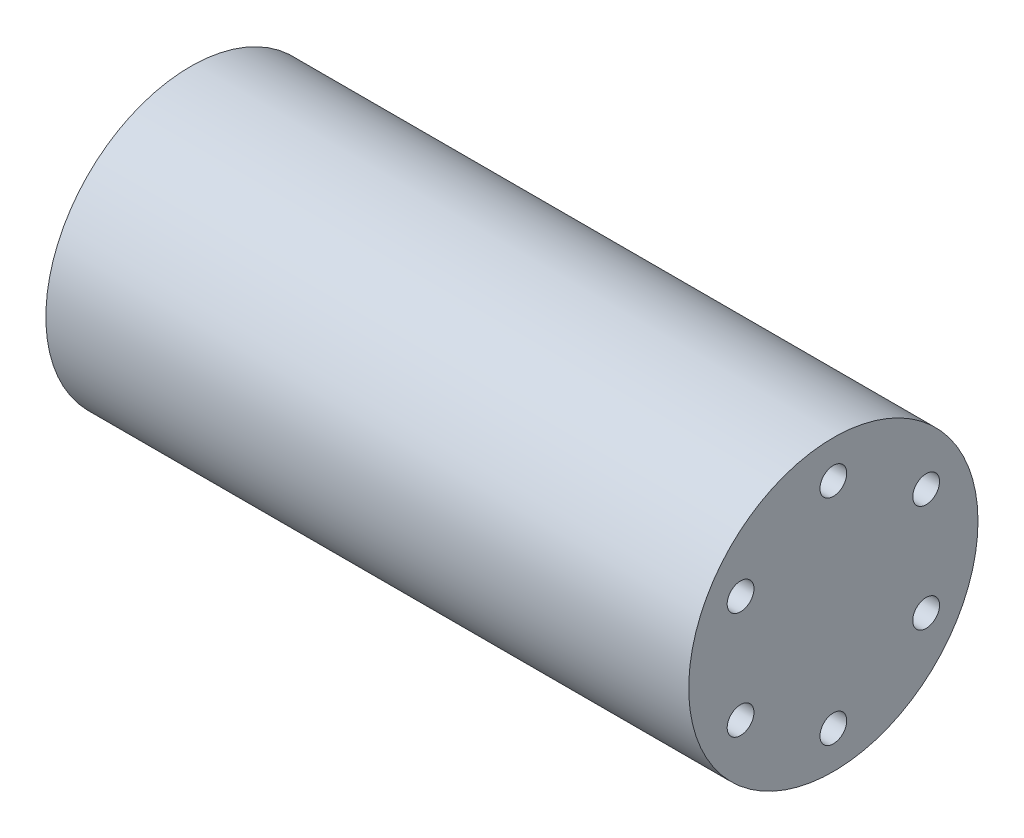
ISO-10303-21;
HEADER;
FILE_DESCRIPTION(('STEP AP214'),'2;1');
FILE_NAME('part.step','',(''),(''),'','','');
FILE_SCHEMA(('AUTOMOTIVE_DESIGN { 1 0 10303 214 1 1 1 1 }'));
ENDSEC;
DATA;
#1=APPLICATION_CONTEXT('core data for automotive mechanical design processes');
#2=APPLICATION_PROTOCOL_DEFINITION('international standard','automotive_design',2000,#1);
#3=PRODUCT_CONTEXT('',#1,'mechanical');
#4=PRODUCT('Part','Part','',(#3));
#5=PRODUCT_RELATED_PRODUCT_CATEGORY('part','',(#4));
#6=PRODUCT_DEFINITION_FORMATION('','',#4);
#7=PRODUCT_DEFINITION_CONTEXT('part definition',#1,'design');
#8=PRODUCT_DEFINITION('design','',#6,#7);
#9=PRODUCT_DEFINITION_SHAPE('','',#8);
#10=(LENGTH_UNIT() NAMED_UNIT(*) SI_UNIT(.MILLI.,.METRE.));
#11=(NAMED_UNIT(*) PLANE_ANGLE_UNIT() SI_UNIT($,.RADIAN.));
#12=(NAMED_UNIT(*) SI_UNIT($,.STERADIAN.) SOLID_ANGLE_UNIT());
#13=UNCERTAINTY_MEASURE_WITH_UNIT(LENGTH_MEASURE(1.E-05),#10,'distance_accuracy_value','');
#14=(GEOMETRIC_REPRESENTATION_CONTEXT(3) GLOBAL_UNCERTAINTY_ASSIGNED_CONTEXT((#13)) GLOBAL_UNIT_ASSIGNED_CONTEXT((#10,
#11,#12)) REPRESENTATION_CONTEXT('',''));
#15=CARTESIAN_POINT('',(0.,0.,0.));
#16=DIRECTION('',(0.,0.,1.));
#17=DIRECTION('',(1.,0.,0.));
#18=AXIS2_PLACEMENT_3D('',#15,#16,#17);
#19=CARTESIAN_POINT('',(30.,0.,0.));
#20=DIRECTION('',(-1.,0.,0.));
#21=DIRECTION('',(0.,0.,1.));
#22=AXIS2_PLACEMENT_3D('',#19,#20,#21);
#23=CYLINDRICAL_SURFACE('',#22,13.5);
#24=CARTESIAN_POINT('',(30.,0.,0.));
#25=DIRECTION('',(1.,0.,0.));
#26=DIRECTION('',(0.,0.,-1.));
#27=AXIS2_PLACEMENT_3D('',#24,#25,#26);
#28=CIRCLE('',#27,13.5);
#29=CARTESIAN_POINT('',(30.,0.,-13.5));
#30=VERTEX_POINT('',#29);
#31=EDGE_CURVE('E10',#30,#30,#28,.T.);
#32=ORIENTED_EDGE('',*,*,#31,.F.);
#33=EDGE_LOOP('',(#32));
#34=FACE_BOUND('',#33,.T.);
#35=CARTESIAN_POINT('',(-30.,0.,0.));
#36=DIRECTION('',(1.,0.,0.));
#37=DIRECTION('',(0.,0.,-1.));
#38=AXIS2_PLACEMENT_3D('',#35,#36,#37);
#39=CIRCLE('',#38,13.5);
#40=CARTESIAN_POINT('',(-30.,0.,-13.5));
#41=VERTEX_POINT('',#40);
#42=EDGE_CURVE('E46',#41,#41,#39,.T.);
#43=ORIENTED_EDGE('',*,*,#42,.T.);
#44=EDGE_LOOP('',(#43));
#45=FACE_BOUND('',#44,.T.);
#46=ADVANCED_FACE('F43',(#34,#45),#23,.T.);
#47=CARTESIAN_POINT('',(30.,0.,0.));
#48=DIRECTION('',(1.,0.,0.));
#49=DIRECTION('',(0.,0.,-1.));
#50=AXIS2_PLACEMENT_3D('',#47,#48,#49);
#51=PLANE('',#50);
#52=CARTESIAN_POINT('',(30.,10.,0.));
#53=DIRECTION('',(-1.,0.,0.));
#54=DIRECTION('',(0.,0.,1.));
#55=AXIS2_PLACEMENT_3D('',#52,#53,#54);
#56=CIRCLE('',#55,1.25);
#57=CARTESIAN_POINT('',(30.,10.,1.25));
#58=VERTEX_POINT('',#57);
#59=EDGE_CURVE('E138',#58,#58,#56,.T.);
#60=ORIENTED_EDGE('',*,*,#59,.T.);
#61=EDGE_LOOP('',(#60));
#62=FACE_BOUND('',#61,.T.);
#63=CARTESIAN_POINT('',(30.,5.0000000000001,-8.66025403784433));
#64=DIRECTION('',(-1.,0.,0.));
#65=DIRECTION('',(0.,0.,1.));
#66=AXIS2_PLACEMENT_3D('',#63,#64,#65);
#67=CIRCLE('',#66,1.25);
#68=CARTESIAN_POINT('',(30.,5.0000000000001,-7.41025403784433));
#69=VERTEX_POINT('',#68);
#70=EDGE_CURVE('E139',#69,#69,#67,.T.);
#71=ORIENTED_EDGE('',*,*,#70,.T.);
#72=EDGE_LOOP('',(#71));
#73=FACE_BOUND('',#72,.T.);
#74=CARTESIAN_POINT('',(30.,-4.99999999999992,-8.66025403784443));
#75=DIRECTION('',(-1.,0.,0.));
#76=DIRECTION('',(0.,0.,1.));
#77=AXIS2_PLACEMENT_3D('',#74,#75,#76);
#78=CIRCLE('',#77,1.25);
#79=CARTESIAN_POINT('',(30.,-4.99999999999992,-7.41025403784443));
#80=VERTEX_POINT('',#79);
#81=EDGE_CURVE('E105',#80,#80,#78,.T.);
#82=ORIENTED_EDGE('',*,*,#81,.T.);
#83=EDGE_LOOP('',(#82));
#84=FACE_BOUND('',#83,.T.);
#85=CARTESIAN_POINT('',(30.,-10.,0.));
#86=DIRECTION('',(-1.,0.,0.));
#87=DIRECTION('',(0.,0.,1.));
#88=AXIS2_PLACEMENT_3D('',#85,#86,#87);
#89=CIRCLE('',#88,1.25);
#90=CARTESIAN_POINT('',(30.,-10.,1.24999999999993));
#91=VERTEX_POINT('',#90);
#92=EDGE_CURVE('E114',#91,#91,#89,.T.);
#93=ORIENTED_EDGE('',*,*,#92,.T.);
#94=EDGE_LOOP('',(#93));
#95=FACE_BOUND('',#94,.T.);
#96=CARTESIAN_POINT('',(30.,-5.00000000000004,8.66025403784437));
#97=DIRECTION('',(-1.,0.,0.));
#98=DIRECTION('',(0.,0.,1.));
#99=AXIS2_PLACEMENT_3D('',#96,#97,#98);
#100=CIRCLE('',#99,1.25);
#101=CARTESIAN_POINT('',(30.,-5.00000000000004,9.91025403784437));
#102=VERTEX_POINT('',#101);
#103=EDGE_CURVE('E122',#102,#102,#100,.T.);
#104=ORIENTED_EDGE('',*,*,#103,.T.);
#105=EDGE_LOOP('',(#104));
#106=FACE_BOUND('',#105,.T.);
#107=CARTESIAN_POINT('',(30.,4.99999999999998,8.6602540378444));
#108=DIRECTION('',(-1.,0.,0.));
#109=DIRECTION('',(0.,0.,1.));
#110=AXIS2_PLACEMENT_3D('',#107,#108,#109);
#111=CIRCLE('',#110,1.25);
#112=CARTESIAN_POINT('',(30.,4.99999999999998,9.9102540378444));
#113=VERTEX_POINT('',#112);
#114=EDGE_CURVE('E130',#113,#113,#111,.T.);
#115=ORIENTED_EDGE('',*,*,#114,.T.);
#116=EDGE_LOOP('',(#115));
#117=FACE_BOUND('',#116,.T.);
#118=ORIENTED_EDGE('',*,*,#31,.T.);
#119=EDGE_LOOP('',(#118));
#120=FACE_BOUND('',#119,.T.);
#121=ADVANCED_FACE('F165',(#62,#73,#84,#95,#106,#117,#120),#51,.T.);
#122=CARTESIAN_POINT('',(-30.,0.,0.));
#123=DIRECTION('',(1.,0.,0.));
#124=DIRECTION('',(0.,0.,-1.));
#125=AXIS2_PLACEMENT_3D('',#122,#123,#124);
#126=PLANE('',#125);
#127=CARTESIAN_POINT('',(-30.,10.,0.));
#128=DIRECTION('',(-1.,0.,0.));
#129=DIRECTION('',(0.,0.,1.));
#130=AXIS2_PLACEMENT_3D('',#127,#128,#129);
#131=CIRCLE('',#130,1.25);
#132=CARTESIAN_POINT('',(-30.,10.,1.25));
#133=VERTEX_POINT('',#132);
#134=EDGE_CURVE('E90',#133,#133,#131,.T.);
#135=ORIENTED_EDGE('',*,*,#134,.F.);
#136=EDGE_LOOP('',(#135));
#137=FACE_BOUND('',#136,.T.);
#138=CARTESIAN_POINT('',(-30.,5.0000000000001,-8.66025403784433));
#139=DIRECTION('',(-1.,0.,0.));
#140=DIRECTION('',(0.,0.,1.));
#141=AXIS2_PLACEMENT_3D('',#138,#139,#140);
#142=CIRCLE('',#141,1.25);
#143=CARTESIAN_POINT('',(-30.,5.0000000000001,-7.41025403784433));
#144=VERTEX_POINT('',#143);
#145=EDGE_CURVE('E62',#144,#144,#142,.T.);
#146=ORIENTED_EDGE('',*,*,#145,.F.);
#147=EDGE_LOOP('',(#146));
#148=FACE_BOUND('',#147,.T.);
#149=CARTESIAN_POINT('',(-30.,-4.99999999999992,-8.66025403784443));
#150=DIRECTION('',(-1.,0.,0.));
#151=DIRECTION('',(0.,0.,1.));
#152=AXIS2_PLACEMENT_3D('',#149,#150,#151);
#153=CIRCLE('',#152,1.25);
#154=CARTESIAN_POINT('',(-30.,-4.99999999999992,-7.41025403784443));
#155=VERTEX_POINT('',#154);
#156=EDGE_CURVE('E61',#155,#155,#153,.T.);
#157=ORIENTED_EDGE('',*,*,#156,.F.);
#158=EDGE_LOOP('',(#157));
#159=FACE_BOUND('',#158,.T.);
#160=CARTESIAN_POINT('',(-30.,-10.,0.));
#161=DIRECTION('',(-1.,0.,0.));
#162=DIRECTION('',(0.,0.,1.));
#163=AXIS2_PLACEMENT_3D('',#160,#161,#162);
#164=CIRCLE('',#163,1.25);
#165=CARTESIAN_POINT('',(-30.,-10.,1.24999999999993));
#166=VERTEX_POINT('',#165);
#167=EDGE_CURVE('E70',#166,#166,#164,.T.);
#168=ORIENTED_EDGE('',*,*,#167,.F.);
#169=EDGE_LOOP('',(#168));
#170=FACE_BOUND('',#169,.T.);
#171=CARTESIAN_POINT('',(-30.,-5.00000000000004,8.66025403784437));
#172=DIRECTION('',(-1.,0.,0.));
#173=DIRECTION('',(0.,0.,1.));
#174=AXIS2_PLACEMENT_3D('',#171,#172,#173);
#175=CIRCLE('',#174,1.25);
#176=CARTESIAN_POINT('',(-30.,-5.00000000000004,9.91025403784437));
#177=VERTEX_POINT('',#176);
#178=EDGE_CURVE('E78',#177,#177,#175,.T.);
#179=ORIENTED_EDGE('',*,*,#178,.F.);
#180=EDGE_LOOP('',(#179));
#181=FACE_BOUND('',#180,.T.);
#182=CARTESIAN_POINT('',(-30.,4.99999999999998,8.6602540378444));
#183=DIRECTION('',(-1.,0.,0.));
#184=DIRECTION('',(0.,0.,1.));
#185=AXIS2_PLACEMENT_3D('',#182,#183,#184);
#186=CIRCLE('',#185,1.25);
#187=CARTESIAN_POINT('',(-30.,4.99999999999998,9.9102540378444));
#188=VERTEX_POINT('',#187);
#189=EDGE_CURVE('E86',#188,#188,#186,.T.);
#190=ORIENTED_EDGE('',*,*,#189,.F.);
#191=EDGE_LOOP('',(#190));
#192=FACE_BOUND('',#191,.T.);
#193=ORIENTED_EDGE('',*,*,#42,.F.);
#194=EDGE_LOOP('',(#193));
#195=FACE_BOUND('',#194,.T.);
#196=ADVANCED_FACE('F171',(#137,#148,#159,#170,#181,#192,#195),#126,.F.);
#197=CARTESIAN_POINT('',(-26.,4.99999999999998,8.6602540378444));
#198=DIRECTION('',(-1.,0.,0.));
#199=DIRECTION('',(0.,0.,1.));
#200=AXIS2_PLACEMENT_3D('',#197,#198,#199);
#201=CYLINDRICAL_SURFACE('',#200,1.25);
#202=CARTESIAN_POINT('',(-26.,4.99999999999998,8.6602540378444));
#203=DIRECTION('',(-1.,0.,0.));
#204=DIRECTION('',(0.,0.,1.));
#205=AXIS2_PLACEMENT_3D('',#202,#203,#204);
#206=CIRCLE('',#205,1.25);
#207=CARTESIAN_POINT('',(-26.,4.99999999999998,9.9102540378444));
#208=VERTEX_POINT('',#207);
#209=EDGE_CURVE('E82',#208,#208,#206,.T.);
#210=ORIENTED_EDGE('',*,*,#209,.F.);
#211=EDGE_LOOP('',(#210));
#212=FACE_BOUND('',#211,.T.);
#213=ORIENTED_EDGE('',*,*,#189,.T.);
#214=EDGE_LOOP('',(#213));
#215=FACE_BOUND('',#214,.T.);
#216=ADVANCED_FACE('F177',(#212,#215),#201,.F.);
#217=CARTESIAN_POINT('',(-26.,4.99999999999998,8.6602540378444));
#218=DIRECTION('',(-1.,0.,0.));
#219=DIRECTION('',(0.,0.,1.));
#220=AXIS2_PLACEMENT_3D('',#217,#218,#219);
#221=PLANE('',#220);
#222=ORIENTED_EDGE('',*,*,#209,.T.);
#223=EDGE_LOOP('',(#222));
#224=FACE_BOUND('',#223,.T.);
#225=ADVANCED_FACE('F182',(#224),#221,.T.);
#226=CARTESIAN_POINT('',(-26.,-5.00000000000004,8.66025403784437));
#227=DIRECTION('',(-1.,0.,0.));
#228=DIRECTION('',(0.,0.,1.));
#229=AXIS2_PLACEMENT_3D('',#226,#227,#228);
#230=CYLINDRICAL_SURFACE('',#229,1.25);
#231=CARTESIAN_POINT('',(-26.,-5.00000000000004,8.66025403784437));
#232=DIRECTION('',(-1.,0.,0.));
#233=DIRECTION('',(0.,0.,1.));
#234=AXIS2_PLACEMENT_3D('',#231,#232,#233);
#235=CIRCLE('',#234,1.25);
#236=CARTESIAN_POINT('',(-26.,-5.00000000000004,9.91025403784437));
#237=VERTEX_POINT('',#236);
#238=EDGE_CURVE('E74',#237,#237,#235,.T.);
#239=ORIENTED_EDGE('',*,*,#238,.F.);
#240=EDGE_LOOP('',(#239));
#241=FACE_BOUND('',#240,.T.);
#242=ORIENTED_EDGE('',*,*,#178,.T.);
#243=EDGE_LOOP('',(#242));
#244=FACE_BOUND('',#243,.T.);
#245=ADVANCED_FACE('F208',(#241,#244),#230,.F.);
#246=CARTESIAN_POINT('',(-26.,-5.00000000000004,8.66025403784437));
#247=DIRECTION('',(-1.,0.,0.));
#248=DIRECTION('',(0.,0.,1.));
#249=AXIS2_PLACEMENT_3D('',#246,#247,#248);
#250=PLANE('',#249);
#251=ORIENTED_EDGE('',*,*,#238,.T.);
#252=EDGE_LOOP('',(#251));
#253=FACE_BOUND('',#252,.T.);
#254=ADVANCED_FACE('F204',(#253),#250,.T.);
#255=CARTESIAN_POINT('',(-26.,-10.,0.));
#256=DIRECTION('',(-1.,0.,0.));
#257=DIRECTION('',(0.,0.,1.));
#258=AXIS2_PLACEMENT_3D('',#255,#256,#257);
#259=CYLINDRICAL_SURFACE('',#258,1.25);
#260=CARTESIAN_POINT('',(-26.,-10.,0.));
#261=DIRECTION('',(-1.,0.,0.));
#262=DIRECTION('',(0.,0.,1.));
#263=AXIS2_PLACEMENT_3D('',#260,#261,#262);
#264=CIRCLE('',#263,1.25);
#265=CARTESIAN_POINT('',(-26.,-10.,1.24999999999993));
#266=VERTEX_POINT('',#265);
#267=EDGE_CURVE('E66',#266,#266,#264,.T.);
#268=ORIENTED_EDGE('',*,*,#267,.F.);
#269=EDGE_LOOP('',(#268));
#270=FACE_BOUND('',#269,.T.);
#271=ORIENTED_EDGE('',*,*,#167,.T.);
#272=EDGE_LOOP('',(#271));
#273=FACE_BOUND('',#272,.T.);
#274=ADVANCED_FACE('F200',(#270,#273),#259,.F.);
#275=CARTESIAN_POINT('',(-26.,-10.,0.));
#276=DIRECTION('',(-1.,0.,0.));
#277=DIRECTION('',(0.,0.,1.));
#278=AXIS2_PLACEMENT_3D('',#275,#276,#277);
#279=PLANE('',#278);
#280=ORIENTED_EDGE('',*,*,#267,.T.);
#281=EDGE_LOOP('',(#280));
#282=FACE_BOUND('',#281,.T.);
#283=ADVANCED_FACE('F196',(#282),#279,.T.);
#284=CARTESIAN_POINT('',(-26.,-4.99999999999992,-8.66025403784443));
#285=DIRECTION('',(-1.,0.,0.));
#286=DIRECTION('',(0.,0.,1.));
#287=AXIS2_PLACEMENT_3D('',#284,#285,#286);
#288=CYLINDRICAL_SURFACE('',#287,1.25);
#289=CARTESIAN_POINT('',(-26.,-4.99999999999992,-8.66025403784443));
#290=DIRECTION('',(-1.,0.,0.));
#291=DIRECTION('',(0.,0.,1.));
#292=AXIS2_PLACEMENT_3D('',#289,#290,#291);
#293=CIRCLE('',#292,1.25);
#294=CARTESIAN_POINT('',(-26.,-4.99999999999992,-7.41025403784443));
#295=VERTEX_POINT('',#294);
#296=EDGE_CURVE('E57',#295,#295,#293,.T.);
#297=ORIENTED_EDGE('',*,*,#296,.F.);
#298=EDGE_LOOP('',(#297));
#299=FACE_BOUND('',#298,.T.);
#300=ORIENTED_EDGE('',*,*,#156,.T.);
#301=EDGE_LOOP('',(#300));
#302=FACE_BOUND('',#301,.T.);
#303=ADVANCED_FACE('F192',(#299,#302),#288,.F.);
#304=CARTESIAN_POINT('',(-26.,-4.99999999999992,-8.66025403784443));
#305=DIRECTION('',(-1.,0.,0.));
#306=DIRECTION('',(0.,0.,1.));
#307=AXIS2_PLACEMENT_3D('',#304,#305,#306);
#308=PLANE('',#307);
#309=ORIENTED_EDGE('',*,*,#296,.T.);
#310=EDGE_LOOP('',(#309));
#311=FACE_BOUND('',#310,.T.);
#312=ADVANCED_FACE('F188',(#311),#308,.T.);
#313=CARTESIAN_POINT('',(-26.,5.0000000000001,-8.66025403784433));
#314=DIRECTION('',(-1.,0.,0.));
#315=DIRECTION('',(0.,0.,1.));
#316=AXIS2_PLACEMENT_3D('',#313,#314,#315);
#317=CYLINDRICAL_SURFACE('',#316,1.25);
#318=CARTESIAN_POINT('',(-26.,5.0000000000001,-8.66025403784433));
#319=DIRECTION('',(-1.,0.,0.));
#320=DIRECTION('',(0.,0.,1.));
#321=AXIS2_PLACEMENT_3D('',#318,#319,#320);
#322=CIRCLE('',#321,1.25);
#323=CARTESIAN_POINT('',(-26.,5.0000000000001,-7.41025403784433));
#324=VERTEX_POINT('',#323);
#325=EDGE_CURVE('E91',#324,#324,#322,.T.);
#326=ORIENTED_EDGE('',*,*,#325,.F.);
#327=EDGE_LOOP('',(#326));
#328=FACE_BOUND('',#327,.T.);
#329=ORIENTED_EDGE('',*,*,#145,.T.);
#330=EDGE_LOOP('',(#329));
#331=FACE_BOUND('',#330,.T.);
#332=ADVANCED_FACE('F191',(#328,#331),#317,.F.);
#333=CARTESIAN_POINT('',(-26.,5.0000000000001,-8.66025403784433));
#334=DIRECTION('',(-1.,0.,0.));
#335=DIRECTION('',(0.,0.,1.));
#336=AXIS2_PLACEMENT_3D('',#333,#334,#335);
#337=PLANE('',#336);
#338=ORIENTED_EDGE('',*,*,#325,.T.);
#339=EDGE_LOOP('',(#338));
#340=FACE_BOUND('',#339,.T.);
#341=ADVANCED_FACE('F216',(#340),#337,.T.);
#342=CARTESIAN_POINT('',(-26.,10.,0.));
#343=DIRECTION('',(-1.,0.,0.));
#344=DIRECTION('',(0.,0.,1.));
#345=AXIS2_PLACEMENT_3D('',#342,#343,#344);
#346=CYLINDRICAL_SURFACE('',#345,1.25);
#347=CARTESIAN_POINT('',(-26.,10.,0.));
#348=DIRECTION('',(-1.,0.,0.));
#349=DIRECTION('',(0.,0.,1.));
#350=AXIS2_PLACEMENT_3D('',#347,#348,#349);
#351=CIRCLE('',#350,1.25);
#352=CARTESIAN_POINT('',(-26.,10.,1.25));
#353=VERTEX_POINT('',#352);
#354=EDGE_CURVE('E55',#353,#353,#351,.T.);
#355=ORIENTED_EDGE('',*,*,#354,.F.);
#356=EDGE_LOOP('',(#355));
#357=FACE_BOUND('',#356,.T.);
#358=ORIENTED_EDGE('',*,*,#134,.T.);
#359=EDGE_LOOP('',(#358));
#360=FACE_BOUND('',#359,.T.);
#361=ADVANCED_FACE('F219',(#357,#360),#346,.F.);
#362=CARTESIAN_POINT('',(-26.,10.,0.));
#363=DIRECTION('',(-1.,0.,0.));
#364=DIRECTION('',(0.,0.,1.));
#365=AXIS2_PLACEMENT_3D('',#362,#363,#364);
#366=PLANE('',#365);
#367=ORIENTED_EDGE('',*,*,#354,.T.);
#368=EDGE_LOOP('',(#367));
#369=FACE_BOUND('',#368,.T.);
#370=ADVANCED_FACE('F226',(#369),#366,.T.);
#371=CARTESIAN_POINT('',(26.,4.99999999999998,8.6602540378444));
#372=DIRECTION('',(1.,0.,0.));
#373=DIRECTION('',(0.,0.,-1.));
#374=AXIS2_PLACEMENT_3D('',#371,#372,#373);
#375=CYLINDRICAL_SURFACE('',#374,1.25);
#376=CARTESIAN_POINT('',(26.,4.99999999999998,8.6602540378444));
#377=DIRECTION('',(-1.,0.,0.));
#378=DIRECTION('',(0.,0.,1.));
#379=AXIS2_PLACEMENT_3D('',#376,#377,#378);
#380=CIRCLE('',#379,1.25);
#381=CARTESIAN_POINT('',(26.,4.99999999999998,9.9102540378444));
#382=VERTEX_POINT('',#381);
#383=EDGE_CURVE('E134',#382,#382,#380,.T.);
#384=ORIENTED_EDGE('',*,*,#383,.T.);
#385=EDGE_LOOP('',(#384));
#386=FACE_BOUND('',#385,.T.);
#387=ORIENTED_EDGE('',*,*,#114,.F.);
#388=EDGE_LOOP('',(#387));
#389=FACE_BOUND('',#388,.T.);
#390=ADVANCED_FACE('F230',(#386,#389),#375,.F.);
#391=CARTESIAN_POINT('',(26.,4.99999999999998,8.6602540378444));
#392=DIRECTION('',(1.,0.,0.));
#393=DIRECTION('',(0.,0.,1.));
#394=AXIS2_PLACEMENT_3D('',#391,#392,#393);
#395=PLANE('',#394);
#396=ORIENTED_EDGE('',*,*,#383,.F.);
#397=EDGE_LOOP('',(#396));
#398=FACE_BOUND('',#397,.T.);
#399=ADVANCED_FACE('F253',(#398),#395,.T.);
#400=CARTESIAN_POINT('',(26.,-5.00000000000004,8.66025403784437));
#401=DIRECTION('',(1.,0.,0.));
#402=DIRECTION('',(0.,0.,-1.));
#403=AXIS2_PLACEMENT_3D('',#400,#401,#402);
#404=CYLINDRICAL_SURFACE('',#403,1.25);
#405=CARTESIAN_POINT('',(26.,-5.00000000000004,8.66025403784437));
#406=DIRECTION('',(-1.,0.,0.));
#407=DIRECTION('',(0.,0.,1.));
#408=AXIS2_PLACEMENT_3D('',#405,#406,#407);
#409=CIRCLE('',#408,1.25);
#410=CARTESIAN_POINT('',(26.,-5.00000000000004,9.91025403784437));
#411=VERTEX_POINT('',#410);
#412=EDGE_CURVE('E126',#411,#411,#409,.T.);
#413=ORIENTED_EDGE('',*,*,#412,.T.);
#414=EDGE_LOOP('',(#413));
#415=FACE_BOUND('',#414,.T.);
#416=ORIENTED_EDGE('',*,*,#103,.F.);
#417=EDGE_LOOP('',(#416));
#418=FACE_BOUND('',#417,.T.);
#419=ADVANCED_FACE('F250',(#415,#418),#404,.F.);
#420=CARTESIAN_POINT('',(26.,-5.00000000000004,8.66025403784437));
#421=DIRECTION('',(1.,0.,0.));
#422=DIRECTION('',(0.,0.,1.));
#423=AXIS2_PLACEMENT_3D('',#420,#421,#422);
#424=PLANE('',#423);
#425=ORIENTED_EDGE('',*,*,#412,.F.);
#426=EDGE_LOOP('',(#425));
#427=FACE_BOUND('',#426,.T.);
#428=ADVANCED_FACE('F245',(#427),#424,.T.);
#429=CARTESIAN_POINT('',(26.,-10.,0.));
#430=DIRECTION('',(1.,0.,0.));
#431=DIRECTION('',(0.,0.,-1.));
#432=AXIS2_PLACEMENT_3D('',#429,#430,#431);
#433=CYLINDRICAL_SURFACE('',#432,1.25);
#434=CARTESIAN_POINT('',(26.,-10.,0.));
#435=DIRECTION('',(-1.,0.,0.));
#436=DIRECTION('',(0.,0.,1.));
#437=AXIS2_PLACEMENT_3D('',#434,#435,#436);
#438=CIRCLE('',#437,1.25);
#439=CARTESIAN_POINT('',(26.,-10.,1.24999999999993));
#440=VERTEX_POINT('',#439);
#441=EDGE_CURVE('E118',#440,#440,#438,.T.);
#442=ORIENTED_EDGE('',*,*,#441,.T.);
#443=EDGE_LOOP('',(#442));
#444=FACE_BOUND('',#443,.T.);
#445=ORIENTED_EDGE('',*,*,#92,.F.);
#446=EDGE_LOOP('',(#445));
#447=FACE_BOUND('',#446,.T.);
#448=ADVANCED_FACE('F242',(#444,#447),#433,.F.);
#449=CARTESIAN_POINT('',(26.,-10.,0.));
#450=DIRECTION('',(1.,0.,0.));
#451=DIRECTION('',(0.,0.,1.));
#452=AXIS2_PLACEMENT_3D('',#449,#450,#451);
#453=PLANE('',#452);
#454=ORIENTED_EDGE('',*,*,#441,.F.);
#455=EDGE_LOOP('',(#454));
#456=FACE_BOUND('',#455,.T.);
#457=ADVANCED_FACE('F236',(#456),#453,.T.);
#458=CARTESIAN_POINT('',(26.,-4.99999999999992,-8.66025403784443));
#459=DIRECTION('',(1.,0.,0.));
#460=DIRECTION('',(0.,0.,-1.));
#461=AXIS2_PLACEMENT_3D('',#458,#459,#460);
#462=CYLINDRICAL_SURFACE('',#461,1.25);
#463=CARTESIAN_POINT('',(26.,-4.99999999999992,-8.66025403784443));
#464=DIRECTION('',(-1.,0.,0.));
#465=DIRECTION('',(0.,0.,1.));
#466=AXIS2_PLACEMENT_3D('',#463,#464,#465);
#467=CIRCLE('',#466,1.25);
#468=CARTESIAN_POINT('',(26.,-4.99999999999992,-7.41025403784443));
#469=VERTEX_POINT('',#468);
#470=EDGE_CURVE('E109',#469,#469,#467,.T.);
#471=ORIENTED_EDGE('',*,*,#470,.T.);
#472=EDGE_LOOP('',(#471));
#473=FACE_BOUND('',#472,.T.);
#474=ORIENTED_EDGE('',*,*,#81,.F.);
#475=EDGE_LOOP('',(#474));
#476=FACE_BOUND('',#475,.T.);
#477=ADVANCED_FACE('F232',(#473,#476),#462,.F.);
#478=CARTESIAN_POINT('',(26.,-4.99999999999992,-8.66025403784443));
#479=DIRECTION('',(1.,0.,0.));
#480=DIRECTION('',(0.,0.,1.));
#481=AXIS2_PLACEMENT_3D('',#478,#479,#480);
#482=PLANE('',#481);
#483=ORIENTED_EDGE('',*,*,#470,.F.);
#484=EDGE_LOOP('',(#483));
#485=FACE_BOUND('',#484,.T.);
#486=ADVANCED_FACE('F235',(#485),#482,.T.);
#487=CARTESIAN_POINT('',(26.,5.0000000000001,-8.66025403784433));
#488=DIRECTION('',(1.,0.,0.));
#489=DIRECTION('',(0.,0.,-1.));
#490=AXIS2_PLACEMENT_3D('',#487,#488,#489);
#491=CYLINDRICAL_SURFACE('',#490,1.25);
#492=CARTESIAN_POINT('',(26.,5.0000000000001,-8.66025403784433));
#493=DIRECTION('',(-1.,0.,0.));
#494=DIRECTION('',(0.,0.,1.));
#495=AXIS2_PLACEMENT_3D('',#492,#493,#494);
#496=CIRCLE('',#495,1.25);
#497=CARTESIAN_POINT('',(26.,5.0000000000001,-7.41025403784433));
#498=VERTEX_POINT('',#497);
#499=EDGE_CURVE('E110',#498,#498,#496,.T.);
#500=ORIENTED_EDGE('',*,*,#499,.T.);
#501=EDGE_LOOP('',(#500));
#502=FACE_BOUND('',#501,.T.);
#503=ORIENTED_EDGE('',*,*,#70,.F.);
#504=EDGE_LOOP('',(#503));
#505=FACE_BOUND('',#504,.T.);
#506=ADVANCED_FACE('F240',(#502,#505),#491,.F.);
#507=CARTESIAN_POINT('',(26.,5.0000000000001,-8.66025403784433));
#508=DIRECTION('',(1.,0.,0.));
#509=DIRECTION('',(0.,0.,1.));
#510=AXIS2_PLACEMENT_3D('',#507,#508,#509);
#511=PLANE('',#510);
#512=ORIENTED_EDGE('',*,*,#499,.F.);
#513=EDGE_LOOP('',(#512));
#514=FACE_BOUND('',#513,.T.);
#515=ADVANCED_FACE('F162',(#514),#511,.T.);
#516=CARTESIAN_POINT('',(26.,10.,0.));
#517=DIRECTION('',(1.,0.,0.));
#518=DIRECTION('',(0.,0.,-1.));
#519=AXIS2_PLACEMENT_3D('',#516,#517,#518);
#520=CYLINDRICAL_SURFACE('',#519,1.25);
#521=CARTESIAN_POINT('',(26.,10.,0.));
#522=DIRECTION('',(-1.,0.,0.));
#523=DIRECTION('',(0.,0.,1.));
#524=AXIS2_PLACEMENT_3D('',#521,#522,#523);
#525=CIRCLE('',#524,1.25);
#526=CARTESIAN_POINT('',(26.,10.,1.25));
#527=VERTEX_POINT('',#526);
#528=EDGE_CURVE('E95',#527,#527,#525,.T.);
#529=ORIENTED_EDGE('',*,*,#528,.T.);
#530=EDGE_LOOP('',(#529));
#531=FACE_BOUND('',#530,.T.);
#532=ORIENTED_EDGE('',*,*,#59,.F.);
#533=EDGE_LOOP('',(#532));
#534=FACE_BOUND('',#533,.T.);
#535=ADVANCED_FACE('F153',(#531,#534),#520,.F.);
#536=CARTESIAN_POINT('',(26.,10.,0.));
#537=DIRECTION('',(1.,0.,0.));
#538=DIRECTION('',(0.,0.,1.));
#539=AXIS2_PLACEMENT_3D('',#536,#537,#538);
#540=PLANE('',#539);
#541=ORIENTED_EDGE('',*,*,#528,.F.);
#542=EDGE_LOOP('',(#541));
#543=FACE_BOUND('',#542,.T.);
#544=ADVANCED_FACE('F156',(#543),#540,.T.);
#545=CLOSED_SHELL('',(#46,#121,#196,#216,#225,#245,#254,#274,#283,#303,#312,#332,#341,#361,#370,
#390,#399,#419,#428,#448,#457,#477,#486,#506,#515,#535,#544));
#546=MANIFOLD_SOLID_BREP('B2',#545);
#547=ADVANCED_BREP_SHAPE_REPRESENTATION('',(#18,#546),#14);
#548=SHAPE_DEFINITION_REPRESENTATION(#9,#547);
ENDSEC;
END-ISO-10303-21;
